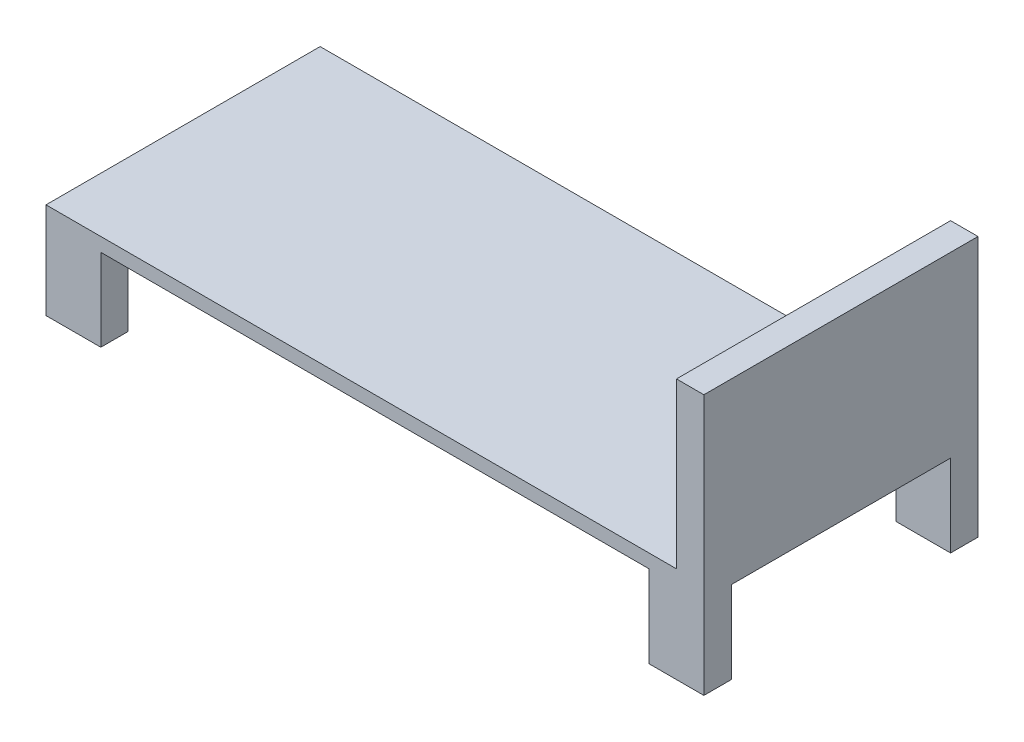
ISO-10303-21;
HEADER;
FILE_DESCRIPTION(('STEP AP214'),'2;1');
FILE_NAME('part.step','',(''),(''),'','','');
FILE_SCHEMA(('AUTOMOTIVE_DESIGN { 1 0 10303 214 1 1 1 1 }'));
ENDSEC;
DATA;
#1=APPLICATION_CONTEXT('core data for automotive mechanical design processes');
#2=APPLICATION_PROTOCOL_DEFINITION('international standard','automotive_design',2000,#1);
#3=PRODUCT_CONTEXT('',#1,'mechanical');
#4=PRODUCT('Part','Part','',(#3));
#5=PRODUCT_RELATED_PRODUCT_CATEGORY('part','',(#4));
#6=PRODUCT_DEFINITION_FORMATION('','',#4);
#7=PRODUCT_DEFINITION_CONTEXT('part definition',#1,'design');
#8=PRODUCT_DEFINITION('design','',#6,#7);
#9=PRODUCT_DEFINITION_SHAPE('','',#8);
#10=(LENGTH_UNIT() NAMED_UNIT(*) SI_UNIT(.MILLI.,.METRE.));
#11=(NAMED_UNIT(*) PLANE_ANGLE_UNIT() SI_UNIT($,.RADIAN.));
#12=(NAMED_UNIT(*) SI_UNIT($,.STERADIAN.) SOLID_ANGLE_UNIT());
#13=UNCERTAINTY_MEASURE_WITH_UNIT(LENGTH_MEASURE(1.E-05),#10,'distance_accuracy_value','');
#14=(GEOMETRIC_REPRESENTATION_CONTEXT(3) GLOBAL_UNCERTAINTY_ASSIGNED_CONTEXT((#13)) GLOBAL_UNIT_ASSIGNED_CONTEXT((#10,
#11,#12)) REPRESENTATION_CONTEXT('',''));
#15=CARTESIAN_POINT('',(0.,0.,0.));
#16=DIRECTION('',(0.,0.,1.));
#17=DIRECTION('',(1.,0.,0.));
#18=AXIS2_PLACEMENT_3D('',#15,#16,#17);
#19=CARTESIAN_POINT('',(0.,0.,0.));
#20=DIRECTION('',(0.,-1.,0.));
#21=DIRECTION('',(0.,0.,-1.));
#22=AXIS2_PLACEMENT_3D('',#19,#20,#21);
#23=PLANE('',#22);
#24=DIRECTION('',(0.,0.,-1.));
#25=VECTOR('',#24,1.);
#26=CARTESIAN_POINT('',(1117.6,0.,-508.));
#27=LINE('',#26,#25);
#28=CARTESIAN_POINT('',(1117.6,0.,-457.2));
#29=VERTEX_POINT('',#28);
#30=CARTESIAN_POINT('',(1117.6,0.,-508.));
#31=VERTEX_POINT('',#30);
#32=EDGE_CURVE('E185',#29,#31,#27,.T.);
#33=ORIENTED_EDGE('',*,*,#32,.F.);
#34=DIRECTION('',(-1.,0.,0.));
#35=VECTOR('',#34,1.);
#36=CARTESIAN_POINT('',(1219.2,0.,-457.2));
#37=LINE('',#36,#35);
#38=CARTESIAN_POINT('',(1219.2,0.,-457.2));
#39=VERTEX_POINT('',#38);
#40=EDGE_CURVE('E360',#39,#29,#37,.T.);
#41=ORIENTED_EDGE('',*,*,#40,.F.);
#42=DIRECTION('',(0.,0.,-1.));
#43=VECTOR('',#42,1.);
#44=CARTESIAN_POINT('',(1219.2,0.,0.));
#45=LINE('',#44,#43);
#46=CARTESIAN_POINT('',(1219.2,0.,-50.8));
#47=VERTEX_POINT('',#46);
#48=EDGE_CURVE('E189',#47,#39,#45,.T.);
#49=ORIENTED_EDGE('',*,*,#48,.F.);
#50=DIRECTION('',(1.,0.,0.));
#51=VECTOR('',#50,1.);
#52=CARTESIAN_POINT('',(1219.2,0.,-50.8));
#53=LINE('',#52,#51);
#54=CARTESIAN_POINT('',(1117.6,0.,-50.8));
#55=VERTEX_POINT('',#54);
#56=EDGE_CURVE('E195',#55,#47,#53,.T.);
#57=ORIENTED_EDGE('',*,*,#56,.F.);
#58=DIRECTION('',(0.,0.,-1.));
#59=VECTOR('',#58,1.);
#60=CARTESIAN_POINT('',(1117.6,0.,0.));
#61=LINE('',#60,#59);
#62=CARTESIAN_POINT('',(1117.6,0.,0.));
#63=VERTEX_POINT('',#62);
#64=EDGE_CURVE('E191',#63,#55,#61,.T.);
#65=ORIENTED_EDGE('',*,*,#64,.F.);
#66=DIRECTION('',(1.,0.,0.));
#67=VECTOR('',#66,1.);
#68=CARTESIAN_POINT('',(0.,0.,0.));
#69=LINE('',#68,#67);
#70=CARTESIAN_POINT('',(101.6,0.,0.));
#71=VERTEX_POINT('',#70);
#72=EDGE_CURVE('E330',#71,#63,#69,.T.);
#73=ORIENTED_EDGE('',*,*,#72,.F.);
#74=DIRECTION('',(0.,0.,1.));
#75=VECTOR('',#74,1.);
#76=CARTESIAN_POINT('',(101.6,0.,0.));
#77=LINE('',#76,#75);
#78=CARTESIAN_POINT('',(101.6,0.,-50.8));
#79=VERTEX_POINT('',#78);
#80=EDGE_CURVE('E261',#79,#71,#77,.T.);
#81=ORIENTED_EDGE('',*,*,#80,.F.);
#82=DIRECTION('',(1.,0.,0.));
#83=VECTOR('',#82,1.);
#84=CARTESIAN_POINT('',(0.,0.,-50.8));
#85=LINE('',#84,#83);
#86=CARTESIAN_POINT('',(0.,0.,-50.8));
#87=VERTEX_POINT('',#86);
#88=EDGE_CURVE('E255',#87,#79,#85,.T.);
#89=ORIENTED_EDGE('',*,*,#88,.F.);
#90=DIRECTION('',(0.,0.,1.));
#91=VECTOR('',#90,1.);
#92=CARTESIAN_POINT('',(0.,0.,0.));
#93=LINE('',#92,#91);
#94=CARTESIAN_POINT('',(0.,0.,-457.2));
#95=VERTEX_POINT('',#94);
#96=EDGE_CURVE('E315',#95,#87,#93,.T.);
#97=ORIENTED_EDGE('',*,*,#96,.F.);
#98=DIRECTION('',(-1.,0.,0.));
#99=VECTOR('',#98,1.);
#100=CARTESIAN_POINT('',(0.,0.,-457.2));
#101=LINE('',#100,#99);
#102=CARTESIAN_POINT('',(101.6,0.,-457.2));
#103=VERTEX_POINT('',#102);
#104=EDGE_CURVE('E230',#103,#95,#101,.T.);
#105=ORIENTED_EDGE('',*,*,#104,.F.);
#106=DIRECTION('',(0.,0.,1.));
#107=VECTOR('',#106,1.);
#108=CARTESIAN_POINT('',(101.6,0.,-508.));
#109=LINE('',#108,#107);
#110=CARTESIAN_POINT('',(101.6,0.,-508.));
#111=VERTEX_POINT('',#110);
#112=EDGE_CURVE('E224',#111,#103,#109,.T.);
#113=ORIENTED_EDGE('',*,*,#112,.F.);
#114=DIRECTION('',(-1.,0.,0.));
#115=VECTOR('',#114,1.);
#116=CARTESIAN_POINT('',(0.,0.,-508.));
#117=LINE('',#116,#115);
#118=EDGE_CURVE('E321',#31,#111,#117,.T.);
#119=ORIENTED_EDGE('',*,*,#118,.F.);
#120=EDGE_LOOP('',(#33,#41,#49,#57,#65,#73,#81,#89,#97,#105,#113,#119));
#121=FACE_BOUND('',#120,.T.);
#122=ADVANCED_FACE('F39',(#121),#23,.T.);
#123=CARTESIAN_POINT('',(0.,25.4,0.));
#124=DIRECTION('',(0.,-1.,0.));
#125=DIRECTION('',(0.,0.,-1.));
#126=AXIS2_PLACEMENT_3D('',#123,#124,#125);
#127=PLANE('',#126);
#128=DIRECTION('',(0.,0.,1.));
#129=VECTOR('',#128,1.);
#130=CARTESIAN_POINT('',(1168.4,25.4,-508.));
#131=LINE('',#130,#129);
#132=CARTESIAN_POINT('',(1168.4,25.4,-508.));
#133=VERTEX_POINT('',#132);
#134=CARTESIAN_POINT('',(1168.4,25.4,0.));
#135=VERTEX_POINT('',#134);
#136=EDGE_CURVE('E289',#133,#135,#131,.T.);
#137=ORIENTED_EDGE('',*,*,#136,.F.);
#138=DIRECTION('',(-1.,0.,0.));
#139=VECTOR('',#138,1.);
#140=CARTESIAN_POINT('',(0.,25.4,-508.));
#141=LINE('',#140,#139);
#142=CARTESIAN_POINT('',(0.,25.4,-508.));
#143=VERTEX_POINT('',#142);
#144=EDGE_CURVE('E324',#133,#143,#141,.T.);
#145=ORIENTED_EDGE('',*,*,#144,.T.);
#146=DIRECTION('',(0.,0.,1.));
#147=VECTOR('',#146,1.);
#148=CARTESIAN_POINT('',(0.,25.4,0.));
#149=LINE('',#148,#147);
#150=CARTESIAN_POINT('',(0.,25.4,0.));
#151=VERTEX_POINT('',#150);
#152=EDGE_CURVE('E316',#143,#151,#149,.T.);
#153=ORIENTED_EDGE('',*,*,#152,.T.);
#154=DIRECTION('',(1.,0.,0.));
#155=VECTOR('',#154,1.);
#156=CARTESIAN_POINT('',(0.,25.4,0.));
#157=LINE('',#156,#155);
#158=EDGE_CURVE('E320',#151,#135,#157,.T.);
#159=ORIENTED_EDGE('',*,*,#158,.T.);
#160=EDGE_LOOP('',(#137,#145,#153,#159));
#161=FACE_BOUND('',#160,.T.);
#162=ADVANCED_FACE('F384',(#161),#127,.F.);
#163=CARTESIAN_POINT('',(0.,25.4,0.));
#164=DIRECTION('',(1.,0.,0.));
#165=DIRECTION('',(0.,0.,-1.));
#166=AXIS2_PLACEMENT_3D('',#163,#164,#165);
#167=PLANE('',#166);
#168=DIRECTION('',(0.,-1.,0.));
#169=VECTOR('',#168,1.);
#170=CARTESIAN_POINT('',(0.,25.4,-508.));
#171=LINE('',#170,#169);
#172=CARTESIAN_POINT('',(0.,-152.4,-508.));
#173=VERTEX_POINT('',#172);
#174=EDGE_CURVE('E327',#143,#173,#171,.T.);
#175=ORIENTED_EDGE('',*,*,#174,.T.);
#176=DIRECTION('',(0.,0.,-1.));
#177=VECTOR('',#176,1.);
#178=CARTESIAN_POINT('',(0.,-152.4,-508.));
#179=LINE('',#178,#177);
#180=CARTESIAN_POINT('',(0.,-152.4,-457.2));
#181=VERTEX_POINT('',#180);
#182=EDGE_CURVE('E225',#181,#173,#179,.T.);
#183=ORIENTED_EDGE('',*,*,#182,.F.);
#184=DIRECTION('',(0.,1.,0.));
#185=VECTOR('',#184,1.);
#186=CARTESIAN_POINT('',(0.,-152.4,-457.2));
#187=LINE('',#186,#185);
#188=EDGE_CURVE('E239',#181,#95,#187,.T.);
#189=ORIENTED_EDGE('',*,*,#188,.T.);
#190=ORIENTED_EDGE('',*,*,#96,.T.);
#191=DIRECTION('',(0.,1.,0.));
#192=VECTOR('',#191,1.);
#193=CARTESIAN_POINT('',(0.,-152.4,-50.8));
#194=LINE('',#193,#192);
#195=CARTESIAN_POINT('',(0.,-152.4,-50.8));
#196=VERTEX_POINT('',#195);
#197=EDGE_CURVE('E285',#196,#87,#194,.T.);
#198=ORIENTED_EDGE('',*,*,#197,.F.);
#199=DIRECTION('',(0.,0.,-1.));
#200=VECTOR('',#199,1.);
#201=CARTESIAN_POINT('',(0.,-152.4,0.));
#202=LINE('',#201,#200);
#203=CARTESIAN_POINT('',(0.,-152.4,0.));
#204=VERTEX_POINT('',#203);
#205=EDGE_CURVE('E256',#204,#196,#202,.T.);
#206=ORIENTED_EDGE('',*,*,#205,.F.);
#207=DIRECTION('',(0.,-1.,0.));
#208=VECTOR('',#207,1.);
#209=CARTESIAN_POINT('',(0.,25.4,0.));
#210=LINE('',#209,#208);
#211=EDGE_CURVE('E11',#151,#204,#210,.T.);
#212=ORIENTED_EDGE('',*,*,#211,.F.);
#213=ORIENTED_EDGE('',*,*,#152,.F.);
#214=EDGE_LOOP('',(#175,#183,#189,#190,#198,#206,#212,#213));
#215=FACE_BOUND('',#214,.T.);
#216=ADVANCED_FACE('F41',(#215),#167,.F.);
#217=CARTESIAN_POINT('',(0.,25.4,0.));
#218=DIRECTION('',(0.,0.,-1.));
#219=DIRECTION('',(-1.,0.,0.));
#220=AXIS2_PLACEMENT_3D('',#217,#218,#219);
#221=PLANE('',#220);
#222=ORIENTED_EDGE('',*,*,#211,.T.);
#223=DIRECTION('',(-1.,0.,0.));
#224=VECTOR('',#223,1.);
#225=CARTESIAN_POINT('',(0.,-152.4,0.));
#226=LINE('',#225,#224);
#227=CARTESIAN_POINT('',(101.6,-152.4,0.));
#228=VERTEX_POINT('',#227);
#229=EDGE_CURVE('E267',#228,#204,#226,.T.);
#230=ORIENTED_EDGE('',*,*,#229,.F.);
#231=DIRECTION('',(0.,1.,0.));
#232=VECTOR('',#231,1.);
#233=CARTESIAN_POINT('',(101.6,-152.4,0.));
#234=LINE('',#233,#232);
#235=EDGE_CURVE('E271',#228,#71,#234,.T.);
#236=ORIENTED_EDGE('',*,*,#235,.T.);
#237=ORIENTED_EDGE('',*,*,#72,.T.);
#238=DIRECTION('',(0.,1.,0.));
#239=VECTOR('',#238,1.);
#240=CARTESIAN_POINT('',(1117.6,-152.4,0.));
#241=LINE('',#240,#239);
#242=CARTESIAN_POINT('',(1117.6,-152.4,0.));
#243=VERTEX_POINT('',#242);
#244=EDGE_CURVE('E221',#243,#63,#241,.T.);
#245=ORIENTED_EDGE('',*,*,#244,.F.);
#246=DIRECTION('',(-1.,0.,0.));
#247=VECTOR('',#246,1.);
#248=CARTESIAN_POINT('',(1219.2,-152.4,0.));
#249=LINE('',#248,#247);
#250=CARTESIAN_POINT('',(1219.2,-152.4,0.));
#251=VERTEX_POINT('',#250);
#252=EDGE_CURVE('E204',#251,#243,#249,.T.);
#253=ORIENTED_EDGE('',*,*,#252,.F.);
#254=DIRECTION('',(0.,-1.,0.));
#255=VECTOR('',#254,1.);
#256=CARTESIAN_POINT('',(1219.2,25.4,0.));
#257=LINE('',#256,#255);
#258=CARTESIAN_POINT('',(1219.2,330.2,0.));
#259=VERTEX_POINT('',#258);
#260=EDGE_CURVE('E48',#259,#251,#257,.T.);
#261=ORIENTED_EDGE('',*,*,#260,.F.);
#262=DIRECTION('',(1.,0.,0.));
#263=VECTOR('',#262,1.);
#264=CARTESIAN_POINT('',(1219.2,330.2,0.));
#265=LINE('',#264,#263);
#266=CARTESIAN_POINT('',(1168.4,330.2,0.));
#267=VERTEX_POINT('',#266);
#268=EDGE_CURVE('E300',#267,#259,#265,.T.);
#269=ORIENTED_EDGE('',*,*,#268,.F.);
#270=DIRECTION('',(0.,-1.,0.));
#271=VECTOR('',#270,1.);
#272=CARTESIAN_POINT('',(1168.4,330.2,0.));
#273=LINE('',#272,#271);
#274=EDGE_CURVE('E304',#267,#135,#273,.T.);
#275=ORIENTED_EDGE('',*,*,#274,.T.);
#276=ORIENTED_EDGE('',*,*,#158,.F.);
#277=EDGE_LOOP('',(#222,#230,#236,#237,#245,#253,#261,#269,#275,#276));
#278=FACE_BOUND('',#277,.T.);
#279=ADVANCED_FACE('F348',(#278),#221,.F.);
#280=CARTESIAN_POINT('',(1219.2,25.4,0.));
#281=DIRECTION('',(-1.,0.,0.));
#282=DIRECTION('',(0.,0.,1.));
#283=AXIS2_PLACEMENT_3D('',#280,#281,#282);
#284=PLANE('',#283);
#285=ORIENTED_EDGE('',*,*,#260,.T.);
#286=DIRECTION('',(0.,0.,1.));
#287=VECTOR('',#286,1.);
#288=CARTESIAN_POINT('',(1219.2,-152.4,0.));
#289=LINE('',#288,#287);
#290=CARTESIAN_POINT('',(1219.2,-152.4,-50.8));
#291=VERTEX_POINT('',#290);
#292=EDGE_CURVE('E200',#291,#251,#289,.T.);
#293=ORIENTED_EDGE('',*,*,#292,.F.);
#294=DIRECTION('',(0.,1.,0.));
#295=VECTOR('',#294,1.);
#296=CARTESIAN_POINT('',(1219.2,-152.4,-50.8));
#297=LINE('',#296,#295);
#298=EDGE_CURVE('E63',#291,#47,#297,.T.);
#299=ORIENTED_EDGE('',*,*,#298,.T.);
#300=ORIENTED_EDGE('',*,*,#48,.T.);
#301=DIRECTION('',(0.,1.,0.));
#302=VECTOR('',#301,1.);
#303=CARTESIAN_POINT('',(1219.2,-152.4,-457.2));
#304=LINE('',#303,#302);
#305=CARTESIAN_POINT('',(1219.2,-152.4,-457.2));
#306=VERTEX_POINT('',#305);
#307=EDGE_CURVE('E170',#306,#39,#304,.T.);
#308=ORIENTED_EDGE('',*,*,#307,.F.);
#309=DIRECTION('',(0.,0.,1.));
#310=VECTOR('',#309,1.);
#311=CARTESIAN_POINT('',(1219.2,-152.4,-508.));
#312=LINE('',#311,#310);
#313=CARTESIAN_POINT('',(1219.2,-152.4,-508.));
#314=VERTEX_POINT('',#313);
#315=EDGE_CURVE('E178',#314,#306,#312,.T.);
#316=ORIENTED_EDGE('',*,*,#315,.F.);
#317=DIRECTION('',(0.,-1.,0.));
#318=VECTOR('',#317,1.);
#319=CARTESIAN_POINT('',(1219.2,25.4,-508.));
#320=LINE('',#319,#318);
#321=CARTESIAN_POINT('',(1219.2,330.2,-508.));
#322=VERTEX_POINT('',#321);
#323=EDGE_CURVE('E340',#322,#314,#320,.T.);
#324=ORIENTED_EDGE('',*,*,#323,.F.);
#325=DIRECTION('',(0.,0.,-1.));
#326=VECTOR('',#325,1.);
#327=CARTESIAN_POINT('',(1219.2,330.2,-508.));
#328=LINE('',#327,#326);
#329=EDGE_CURVE('E290',#259,#322,#328,.T.);
#330=ORIENTED_EDGE('',*,*,#329,.F.);
#331=EDGE_LOOP('',(#285,#293,#299,#300,#308,#316,#324,#330));
#332=FACE_BOUND('',#331,.T.);
#333=ADVANCED_FACE('F187',(#332),#284,.F.);
#334=CARTESIAN_POINT('',(0.,25.4,-508.));
#335=DIRECTION('',(0.,0.,1.));
#336=DIRECTION('',(1.,0.,0.));
#337=AXIS2_PLACEMENT_3D('',#334,#335,#336);
#338=PLANE('',#337);
#339=ORIENTED_EDGE('',*,*,#323,.T.);
#340=DIRECTION('',(1.,0.,0.));
#341=VECTOR('',#340,1.);
#342=CARTESIAN_POINT('',(1219.2,-152.4,-508.));
#343=LINE('',#342,#341);
#344=CARTESIAN_POINT('',(1117.6,-152.4,-508.));
#345=VERTEX_POINT('',#344);
#346=EDGE_CURVE('E183',#345,#314,#343,.T.);
#347=ORIENTED_EDGE('',*,*,#346,.F.);
#348=DIRECTION('',(0.,1.,0.));
#349=VECTOR('',#348,1.);
#350=CARTESIAN_POINT('',(1117.6,-152.4,-508.));
#351=LINE('',#350,#349);
#352=EDGE_CURVE('E55',#345,#31,#351,.T.);
#353=ORIENTED_EDGE('',*,*,#352,.T.);
#354=ORIENTED_EDGE('',*,*,#118,.T.);
#355=DIRECTION('',(0.,1.,0.));
#356=VECTOR('',#355,1.);
#357=CARTESIAN_POINT('',(101.6,-152.4,-508.));
#358=LINE('',#357,#356);
#359=CARTESIAN_POINT('',(101.6,-152.4,-508.));
#360=VERTEX_POINT('',#359);
#361=EDGE_CURVE('E251',#360,#111,#358,.T.);
#362=ORIENTED_EDGE('',*,*,#361,.F.);
#363=DIRECTION('',(1.,0.,0.));
#364=VECTOR('',#363,1.);
#365=CARTESIAN_POINT('',(0.,-152.4,-508.));
#366=LINE('',#365,#364);
#367=EDGE_CURVE('E229',#173,#360,#366,.T.);
#368=ORIENTED_EDGE('',*,*,#367,.F.);
#369=ORIENTED_EDGE('',*,*,#174,.F.);
#370=ORIENTED_EDGE('',*,*,#144,.F.);
#371=DIRECTION('',(0.,-1.,0.));
#372=VECTOR('',#371,1.);
#373=CARTESIAN_POINT('',(1168.4,330.2,-508.));
#374=LINE('',#373,#372);
#375=CARTESIAN_POINT('',(1168.4,330.2,-508.));
#376=VERTEX_POINT('',#375);
#377=EDGE_CURVE('E311',#376,#133,#374,.T.);
#378=ORIENTED_EDGE('',*,*,#377,.F.);
#379=DIRECTION('',(-1.,0.,0.));
#380=VECTOR('',#379,1.);
#381=CARTESIAN_POINT('',(1219.2,330.2,-508.));
#382=LINE('',#381,#380);
#383=EDGE_CURVE('E294',#322,#376,#382,.T.);
#384=ORIENTED_EDGE('',*,*,#383,.F.);
#385=EDGE_LOOP('',(#339,#347,#353,#354,#362,#368,#369,#370,#378,#384));
#386=FACE_BOUND('',#385,.T.);
#387=ADVANCED_FACE('F373',(#386),#338,.F.);
#388=CARTESIAN_POINT('',(1168.4,330.2,-508.));
#389=DIRECTION('',(1.,0.,0.));
#390=DIRECTION('',(0.,0.,-1.));
#391=AXIS2_PLACEMENT_3D('',#388,#389,#390);
#392=PLANE('',#391);
#393=ORIENTED_EDGE('',*,*,#136,.T.);
#394=ORIENTED_EDGE('',*,*,#274,.F.);
#395=DIRECTION('',(0.,0.,1.));
#396=VECTOR('',#395,1.);
#397=CARTESIAN_POINT('',(1168.4,330.2,-508.));
#398=LINE('',#397,#396);
#399=EDGE_CURVE('E297',#376,#267,#398,.T.);
#400=ORIENTED_EDGE('',*,*,#399,.F.);
#401=ORIENTED_EDGE('',*,*,#377,.T.);
#402=EDGE_LOOP('',(#393,#394,#400,#401));
#403=FACE_BOUND('',#402,.T.);
#404=ADVANCED_FACE('F382',(#403),#392,.F.);
#405=CARTESIAN_POINT('',(0.,330.2,0.));
#406=DIRECTION('',(0.,-1.,0.));
#407=DIRECTION('',(0.,0.,-1.));
#408=AXIS2_PLACEMENT_3D('',#405,#406,#407);
#409=PLANE('',#408);
#410=ORIENTED_EDGE('',*,*,#329,.T.);
#411=ORIENTED_EDGE('',*,*,#383,.T.);
#412=ORIENTED_EDGE('',*,*,#399,.T.);
#413=ORIENTED_EDGE('',*,*,#268,.T.);
#414=EDGE_LOOP('',(#410,#411,#412,#413));
#415=FACE_BOUND('',#414,.T.);
#416=ADVANCED_FACE('F379',(#415),#409,.F.);
#417=CARTESIAN_POINT('',(0.,-152.4,-50.8));
#418=DIRECTION('',(0.,0.,1.));
#419=DIRECTION('',(1.,0.,0.));
#420=AXIS2_PLACEMENT_3D('',#417,#418,#419);
#421=PLANE('',#420);
#422=ORIENTED_EDGE('',*,*,#88,.T.);
#423=DIRECTION('',(0.,1.,0.));
#424=VECTOR('',#423,1.);
#425=CARTESIAN_POINT('',(101.6,-152.4,-50.8));
#426=LINE('',#425,#424);
#427=CARTESIAN_POINT('',(101.6,-152.4,-50.8));
#428=VERTEX_POINT('',#427);
#429=EDGE_CURVE('E281',#428,#79,#426,.T.);
#430=ORIENTED_EDGE('',*,*,#429,.F.);
#431=DIRECTION('',(1.,0.,0.));
#432=VECTOR('',#431,1.);
#433=CARTESIAN_POINT('',(0.,-152.4,-50.8));
#434=LINE('',#433,#432);
#435=EDGE_CURVE('E260',#196,#428,#434,.T.);
#436=ORIENTED_EDGE('',*,*,#435,.F.);
#437=ORIENTED_EDGE('',*,*,#197,.T.);
#438=EDGE_LOOP('',(#422,#430,#436,#437));
#439=FACE_BOUND('',#438,.T.);
#440=ADVANCED_FACE('F445',(#439),#421,.F.);
#441=CARTESIAN_POINT('',(101.6,-152.4,0.));
#442=DIRECTION('',(-1.,0.,0.));
#443=DIRECTION('',(0.,0.,1.));
#444=AXIS2_PLACEMENT_3D('',#441,#442,#443);
#445=PLANE('',#444);
#446=ORIENTED_EDGE('',*,*,#80,.T.);
#447=ORIENTED_EDGE('',*,*,#235,.F.);
#448=DIRECTION('',(0.,0.,1.));
#449=VECTOR('',#448,1.);
#450=CARTESIAN_POINT('',(101.6,-152.4,0.));
#451=LINE('',#450,#449);
#452=EDGE_CURVE('E264',#428,#228,#451,.T.);
#453=ORIENTED_EDGE('',*,*,#452,.F.);
#454=ORIENTED_EDGE('',*,*,#429,.T.);
#455=EDGE_LOOP('',(#446,#447,#453,#454));
#456=FACE_BOUND('',#455,.T.);
#457=ADVANCED_FACE('F401',(#456),#445,.F.);
#458=CARTESIAN_POINT('',(0.,-152.4,0.));
#459=DIRECTION('',(0.,-1.,0.));
#460=DIRECTION('',(0.,0.,-1.));
#461=AXIS2_PLACEMENT_3D('',#458,#459,#460);
#462=PLANE('',#461);
#463=ORIENTED_EDGE('',*,*,#205,.T.);
#464=ORIENTED_EDGE('',*,*,#435,.T.);
#465=ORIENTED_EDGE('',*,*,#452,.T.);
#466=ORIENTED_EDGE('',*,*,#229,.T.);
#467=EDGE_LOOP('',(#463,#464,#465,#466));
#468=FACE_BOUND('',#467,.T.);
#469=ADVANCED_FACE('F396',(#468),#462,.T.);
#470=CARTESIAN_POINT('',(101.6,-152.4,-508.));
#471=DIRECTION('',(-1.,0.,0.));
#472=DIRECTION('',(0.,0.,1.));
#473=AXIS2_PLACEMENT_3D('',#470,#471,#472);
#474=PLANE('',#473);
#475=ORIENTED_EDGE('',*,*,#112,.T.);
#476=DIRECTION('',(0.,1.,0.));
#477=VECTOR('',#476,1.);
#478=CARTESIAN_POINT('',(101.6,-152.4,-457.2));
#479=LINE('',#478,#477);
#480=CARTESIAN_POINT('',(101.6,-152.4,-457.2));
#481=VERTEX_POINT('',#480);
#482=EDGE_CURVE('E248',#481,#103,#479,.T.);
#483=ORIENTED_EDGE('',*,*,#482,.F.);
#484=DIRECTION('',(0.,0.,1.));
#485=VECTOR('',#484,1.);
#486=CARTESIAN_POINT('',(101.6,-152.4,-508.));
#487=LINE('',#486,#485);
#488=EDGE_CURVE('E233',#360,#481,#487,.T.);
#489=ORIENTED_EDGE('',*,*,#488,.F.);
#490=ORIENTED_EDGE('',*,*,#361,.T.);
#491=EDGE_LOOP('',(#475,#483,#489,#490));
#492=FACE_BOUND('',#491,.T.);
#493=ADVANCED_FACE('F526',(#492),#474,.F.);
#494=CARTESIAN_POINT('',(0.,-152.4,-457.2));
#495=DIRECTION('',(0.,0.,-1.));
#496=DIRECTION('',(-1.,0.,0.));
#497=AXIS2_PLACEMENT_3D('',#494,#495,#496);
#498=PLANE('',#497);
#499=ORIENTED_EDGE('',*,*,#104,.T.);
#500=ORIENTED_EDGE('',*,*,#188,.F.);
#501=DIRECTION('',(-1.,0.,0.));
#502=VECTOR('',#501,1.);
#503=CARTESIAN_POINT('',(0.,-152.4,-457.2));
#504=LINE('',#503,#502);
#505=EDGE_CURVE('E236',#481,#181,#504,.T.);
#506=ORIENTED_EDGE('',*,*,#505,.F.);
#507=ORIENTED_EDGE('',*,*,#482,.T.);
#508=EDGE_LOOP('',(#499,#500,#506,#507));
#509=FACE_BOUND('',#508,.T.);
#510=ADVANCED_FACE('F413',(#509),#498,.F.);
#511=CARTESIAN_POINT('',(0.,-152.4,0.));
#512=DIRECTION('',(0.,1.,0.));
#513=DIRECTION('',(0.,0.,1.));
#514=AXIS2_PLACEMENT_3D('',#511,#512,#513);
#515=PLANE('',#514);
#516=ORIENTED_EDGE('',*,*,#182,.T.);
#517=ORIENTED_EDGE('',*,*,#367,.T.);
#518=ORIENTED_EDGE('',*,*,#488,.T.);
#519=ORIENTED_EDGE('',*,*,#505,.T.);
#520=EDGE_LOOP('',(#516,#517,#518,#519));
#521=FACE_BOUND('',#520,.T.);
#522=ADVANCED_FACE('F406',(#521),#515,.F.);
#523=CARTESIAN_POINT('',(1117.6,-152.4,0.));
#524=DIRECTION('',(1.,0.,0.));
#525=DIRECTION('',(0.,0.,-1.));
#526=AXIS2_PLACEMENT_3D('',#523,#524,#525);
#527=PLANE('',#526);
#528=ORIENTED_EDGE('',*,*,#64,.T.);
#529=DIRECTION('',(0.,1.,0.));
#530=VECTOR('',#529,1.);
#531=CARTESIAN_POINT('',(1117.6,-152.4,-50.8));
#532=LINE('',#531,#530);
#533=CARTESIAN_POINT('',(1117.6,-152.4,-50.8));
#534=VERTEX_POINT('',#533);
#535=EDGE_CURVE('E217',#534,#55,#532,.T.);
#536=ORIENTED_EDGE('',*,*,#535,.F.);
#537=DIRECTION('',(0.,0.,-1.));
#538=VECTOR('',#537,1.);
#539=CARTESIAN_POINT('',(1117.6,-152.4,0.));
#540=LINE('',#539,#538);
#541=EDGE_CURVE('E207',#243,#534,#540,.T.);
#542=ORIENTED_EDGE('',*,*,#541,.F.);
#543=ORIENTED_EDGE('',*,*,#244,.T.);
#544=EDGE_LOOP('',(#528,#536,#542,#543));
#545=FACE_BOUND('',#544,.T.);
#546=ADVANCED_FACE('F404',(#545),#527,.F.);
#547=CARTESIAN_POINT('',(1219.2,-152.4,-50.8));
#548=DIRECTION('',(0.,0.,1.));
#549=DIRECTION('',(1.,0.,0.));
#550=AXIS2_PLACEMENT_3D('',#547,#548,#549);
#551=PLANE('',#550);
#552=ORIENTED_EDGE('',*,*,#56,.T.);
#553=ORIENTED_EDGE('',*,*,#298,.F.);
#554=DIRECTION('',(1.,0.,0.));
#555=VECTOR('',#554,1.);
#556=CARTESIAN_POINT('',(1219.2,-152.4,-50.8));
#557=LINE('',#556,#555);
#558=EDGE_CURVE('E210',#534,#291,#557,.T.);
#559=ORIENTED_EDGE('',*,*,#558,.F.);
#560=ORIENTED_EDGE('',*,*,#535,.T.);
#561=EDGE_LOOP('',(#552,#553,#559,#560));
#562=FACE_BOUND('',#561,.T.);
#563=ADVANCED_FACE('F355',(#562),#551,.F.);
#564=CARTESIAN_POINT('',(0.,-152.4,0.));
#565=DIRECTION('',(0.,1.,0.));
#566=DIRECTION('',(0.,0.,1.));
#567=AXIS2_PLACEMENT_3D('',#564,#565,#566);
#568=PLANE('',#567);
#569=ORIENTED_EDGE('',*,*,#292,.T.);
#570=ORIENTED_EDGE('',*,*,#252,.T.);
#571=ORIENTED_EDGE('',*,*,#541,.T.);
#572=ORIENTED_EDGE('',*,*,#558,.T.);
#573=EDGE_LOOP('',(#569,#570,#571,#572));
#574=FACE_BOUND('',#573,.T.);
#575=ADVANCED_FACE('F351',(#574),#568,.F.);
#576=CARTESIAN_POINT('',(1219.2,-152.4,-457.2));
#577=DIRECTION('',(0.,0.,-1.));
#578=DIRECTION('',(-1.,0.,0.));
#579=AXIS2_PLACEMENT_3D('',#576,#577,#578);
#580=PLANE('',#579);
#581=ORIENTED_EDGE('',*,*,#40,.T.);
#582=DIRECTION('',(0.,1.,0.));
#583=VECTOR('',#582,1.);
#584=CARTESIAN_POINT('',(1117.6,-152.4,-457.2));
#585=LINE('',#584,#583);
#586=CARTESIAN_POINT('',(1117.6,-152.4,-457.2));
#587=VERTEX_POINT('',#586);
#588=EDGE_CURVE('E173',#587,#29,#585,.T.);
#589=ORIENTED_EDGE('',*,*,#588,.F.);
#590=DIRECTION('',(-1.,0.,0.));
#591=VECTOR('',#590,1.);
#592=CARTESIAN_POINT('',(1219.2,-152.4,-457.2));
#593=LINE('',#592,#591);
#594=EDGE_CURVE('E166',#306,#587,#593,.T.);
#595=ORIENTED_EDGE('',*,*,#594,.F.);
#596=ORIENTED_EDGE('',*,*,#307,.T.);
#597=EDGE_LOOP('',(#581,#589,#595,#596));
#598=FACE_BOUND('',#597,.T.);
#599=ADVANCED_FACE('F168',(#598),#580,.F.);
#600=CARTESIAN_POINT('',(1117.6,-152.4,-508.));
#601=DIRECTION('',(1.,0.,0.));
#602=DIRECTION('',(0.,0.,-1.));
#603=AXIS2_PLACEMENT_3D('',#600,#601,#602);
#604=PLANE('',#603);
#605=ORIENTED_EDGE('',*,*,#32,.T.);
#606=ORIENTED_EDGE('',*,*,#352,.F.);
#607=DIRECTION('',(0.,0.,-1.));
#608=VECTOR('',#607,1.);
#609=CARTESIAN_POINT('',(1117.6,-152.4,-508.));
#610=LINE('',#609,#608);
#611=EDGE_CURVE('E177',#587,#345,#610,.T.);
#612=ORIENTED_EDGE('',*,*,#611,.F.);
#613=ORIENTED_EDGE('',*,*,#588,.T.);
#614=EDGE_LOOP('',(#605,#606,#612,#613));
#615=FACE_BOUND('',#614,.T.);
#616=ADVANCED_FACE('F372',(#615),#604,.F.);
#617=CARTESIAN_POINT('',(0.,-152.4,0.));
#618=DIRECTION('',(0.,-1.,0.));
#619=DIRECTION('',(0.,0.,-1.));
#620=AXIS2_PLACEMENT_3D('',#617,#618,#619);
#621=PLANE('',#620);
#622=ORIENTED_EDGE('',*,*,#315,.T.);
#623=ORIENTED_EDGE('',*,*,#594,.T.);
#624=ORIENTED_EDGE('',*,*,#611,.T.);
#625=ORIENTED_EDGE('',*,*,#346,.T.);
#626=EDGE_LOOP('',(#622,#623,#624,#625));
#627=FACE_BOUND('',#626,.T.);
#628=ADVANCED_FACE('F182',(#627),#621,.T.);
#629=CLOSED_SHELL('',(#122,#162,#216,#279,#333,#387,#404,#416,#440,#457,#469,#493,#510,#522,
#546,#563,#575,#599,#616,#628));
#630=MANIFOLD_SOLID_BREP('B2',#629);
#631=ADVANCED_BREP_SHAPE_REPRESENTATION('',(#18,#630),#14);
#632=SHAPE_DEFINITION_REPRESENTATION(#9,#631);
ENDSEC;
END-ISO-10303-21;
